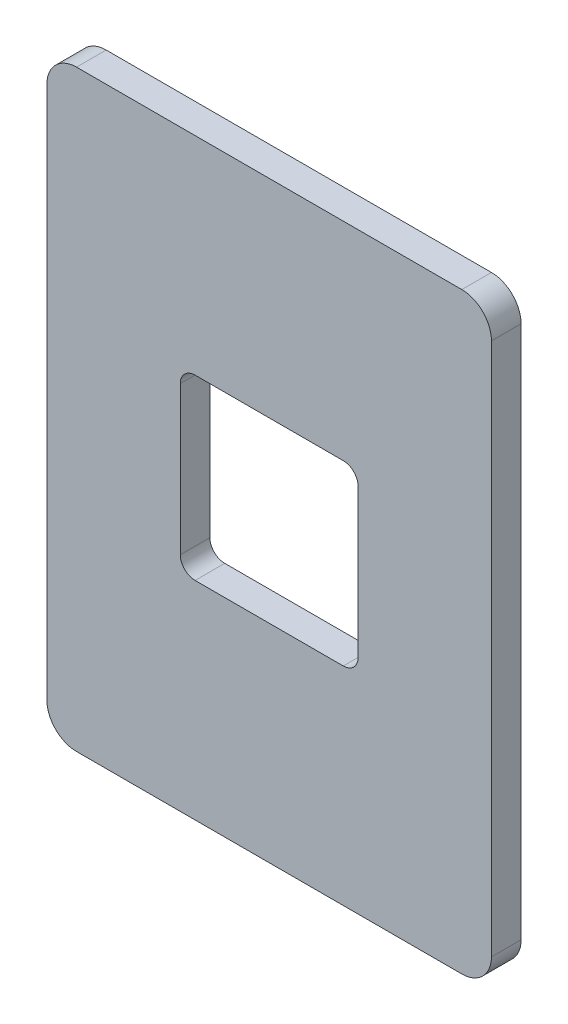
ISO-10303-21;
HEADER;
FILE_DESCRIPTION(('STEP AP214'),'2;1');
FILE_NAME('part.step','',(''),(''),'','','');
FILE_SCHEMA(('AUTOMOTIVE_DESIGN { 1 0 10303 214 1 1 1 1 }'));
ENDSEC;
DATA;
#1=APPLICATION_CONTEXT('core data for automotive mechanical design processes');
#2=APPLICATION_PROTOCOL_DEFINITION('international standard','automotive_design',2000,#1);
#3=PRODUCT_CONTEXT('',#1,'mechanical');
#4=PRODUCT('Part','Part','',(#3));
#5=PRODUCT_RELATED_PRODUCT_CATEGORY('part','',(#4));
#6=PRODUCT_DEFINITION_FORMATION('','',#4);
#7=PRODUCT_DEFINITION_CONTEXT('part definition',#1,'design');
#8=PRODUCT_DEFINITION('design','',#6,#7);
#9=PRODUCT_DEFINITION_SHAPE('','',#8);
#10=(LENGTH_UNIT() NAMED_UNIT(*) SI_UNIT(.MILLI.,.METRE.));
#11=(NAMED_UNIT(*) PLANE_ANGLE_UNIT() SI_UNIT($,.RADIAN.));
#12=(NAMED_UNIT(*) SI_UNIT($,.STERADIAN.) SOLID_ANGLE_UNIT());
#13=UNCERTAINTY_MEASURE_WITH_UNIT(LENGTH_MEASURE(1.E-05),#10,'distance_accuracy_value','');
#14=(GEOMETRIC_REPRESENTATION_CONTEXT(3) GLOBAL_UNCERTAINTY_ASSIGNED_CONTEXT((#13)) GLOBAL_UNIT_ASSIGNED_CONTEXT((#10,
#11,#12)) REPRESENTATION_CONTEXT('',''));
#15=CARTESIAN_POINT('',(0.,0.,0.));
#16=DIRECTION('',(0.,0.,1.));
#17=DIRECTION('',(1.,0.,0.));
#18=AXIS2_PLACEMENT_3D('',#15,#16,#17);
#19=CARTESIAN_POINT('',(15.,-20.,2.));
#20=DIRECTION('',(-1.,0.,0.));
#21=DIRECTION('',(0.,0.,1.));
#22=AXIS2_PLACEMENT_3D('',#19,#20,#21);
#23=PLANE('',#22);
#24=DIRECTION('',(0.,1.,0.));
#25=VECTOR('',#24,1.);
#26=CARTESIAN_POINT('',(15.,-20.,2.));
#27=LINE('',#26,#25);
#28=CARTESIAN_POINT('',(15.,-18.,2.));
#29=VERTEX_POINT('',#28);
#30=CARTESIAN_POINT('',(15.,18.,2.));
#31=VERTEX_POINT('',#30);
#32=EDGE_CURVE('E173',#29,#31,#27,.T.);
#33=ORIENTED_EDGE('',*,*,#32,.F.);
#34=DIRECTION('',(0.,0.,-1.));
#35=VECTOR('',#34,1.);
#36=CARTESIAN_POINT('',(15.,-18.,2.));
#37=LINE('',#36,#35);
#38=CARTESIAN_POINT('',(15.,-18.,0.));
#39=VERTEX_POINT('',#38);
#40=EDGE_CURVE('E157',#29,#39,#37,.T.);
#41=ORIENTED_EDGE('',*,*,#40,.T.);
#42=DIRECTION('',(0.,1.,0.));
#43=VECTOR('',#42,1.);
#44=CARTESIAN_POINT('',(15.,-20.,0.));
#45=LINE('',#44,#43);
#46=CARTESIAN_POINT('',(15.,18.,0.));
#47=VERTEX_POINT('',#46);
#48=EDGE_CURVE('E170',#39,#47,#45,.T.);
#49=ORIENTED_EDGE('',*,*,#48,.T.);
#50=DIRECTION('',(0.,0.,-1.));
#51=VECTOR('',#50,1.);
#52=CARTESIAN_POINT('',(15.,18.,2.));
#53=LINE('',#52,#51);
#54=EDGE_CURVE('E176',#47,#31,#53,.F.);
#55=ORIENTED_EDGE('',*,*,#54,.T.);
#56=EDGE_LOOP('',(#33,#41,#49,#55));
#57=FACE_BOUND('',#56,.T.);
#58=ADVANCED_FACE('F38',(#57),#23,.F.);
#59=CARTESIAN_POINT('',(-15.,20.,2.));
#60=DIRECTION('',(0.,-1.,0.));
#61=DIRECTION('',(0.,0.,-1.));
#62=AXIS2_PLACEMENT_3D('',#59,#60,#61);
#63=PLANE('',#62);
#64=DIRECTION('',(-1.,0.,0.));
#65=VECTOR('',#64,1.);
#66=CARTESIAN_POINT('',(-15.,20.,0.));
#67=LINE('',#66,#65);
#68=CARTESIAN_POINT('',(13.,20.,0.));
#69=VERTEX_POINT('',#68);
#70=CARTESIAN_POINT('',(-13.,20.,0.));
#71=VERTEX_POINT('',#70);
#72=EDGE_CURVE('E181',#69,#71,#67,.T.);
#73=ORIENTED_EDGE('',*,*,#72,.T.);
#74=DIRECTION('',(0.,0.,-1.));
#75=VECTOR('',#74,1.);
#76=CARTESIAN_POINT('',(-13.,20.,2.));
#77=LINE('',#76,#75);
#78=CARTESIAN_POINT('',(-13.,20.,2.));
#79=VERTEX_POINT('',#78);
#80=EDGE_CURVE('E238',#71,#79,#77,.F.);
#81=ORIENTED_EDGE('',*,*,#80,.T.);
#82=DIRECTION('',(-1.,0.,0.));
#83=VECTOR('',#82,1.);
#84=CARTESIAN_POINT('',(-15.,20.,2.));
#85=LINE('',#84,#83);
#86=CARTESIAN_POINT('',(13.,20.,2.));
#87=VERTEX_POINT('',#86);
#88=EDGE_CURVE('E324',#87,#79,#85,.T.);
#89=ORIENTED_EDGE('',*,*,#88,.F.);
#90=DIRECTION('',(0.,0.,-1.));
#91=VECTOR('',#90,1.);
#92=CARTESIAN_POINT('',(13.,20.,2.));
#93=LINE('',#92,#91);
#94=EDGE_CURVE('E234',#87,#69,#93,.T.);
#95=ORIENTED_EDGE('',*,*,#94,.T.);
#96=EDGE_LOOP('',(#73,#81,#89,#95));
#97=FACE_BOUND('',#96,.T.);
#98=ADVANCED_FACE('F350',(#97),#63,.F.);
#99=CARTESIAN_POINT('',(-15.,-20.,2.));
#100=DIRECTION('',(1.,0.,0.));
#101=DIRECTION('',(0.,0.,-1.));
#102=AXIS2_PLACEMENT_3D('',#99,#100,#101);
#103=PLANE('',#102);
#104=DIRECTION('',(0.,-1.,0.));
#105=VECTOR('',#104,1.);
#106=CARTESIAN_POINT('',(-15.,-20.,0.));
#107=LINE('',#106,#105);
#108=CARTESIAN_POINT('',(-15.,18.,0.));
#109=VERTEX_POINT('',#108);
#110=CARTESIAN_POINT('',(-15.,-18.,0.));
#111=VERTEX_POINT('',#110);
#112=EDGE_CURVE('E187',#109,#111,#107,.T.);
#113=ORIENTED_EDGE('',*,*,#112,.T.);
#114=DIRECTION('',(0.,0.,-1.));
#115=VECTOR('',#114,1.);
#116=CARTESIAN_POINT('',(-15.,-18.,2.));
#117=LINE('',#116,#115);
#118=CARTESIAN_POINT('',(-15.,-18.,2.));
#119=VERTEX_POINT('',#118);
#120=EDGE_CURVE('E231',#111,#119,#117,.F.);
#121=ORIENTED_EDGE('',*,*,#120,.T.);
#122=DIRECTION('',(0.,-1.,0.));
#123=VECTOR('',#122,1.);
#124=CARTESIAN_POINT('',(-15.,-20.,2.));
#125=LINE('',#124,#123);
#126=CARTESIAN_POINT('',(-15.,18.,2.));
#127=VERTEX_POINT('',#126);
#128=EDGE_CURVE('E327',#127,#119,#125,.T.);
#129=ORIENTED_EDGE('',*,*,#128,.F.);
#130=DIRECTION('',(0.,0.,-1.));
#131=VECTOR('',#130,1.);
#132=CARTESIAN_POINT('',(-15.,18.,2.));
#133=LINE('',#132,#131);
#134=EDGE_CURVE('E227',#127,#109,#133,.T.);
#135=ORIENTED_EDGE('',*,*,#134,.T.);
#136=EDGE_LOOP('',(#113,#121,#129,#135));
#137=FACE_BOUND('',#136,.T.);
#138=ADVANCED_FACE('F343',(#137),#103,.F.);
#139=CARTESIAN_POINT('',(-15.,-20.,2.));
#140=DIRECTION('',(0.,1.,0.));
#141=DIRECTION('',(0.,0.,1.));
#142=AXIS2_PLACEMENT_3D('',#139,#140,#141);
#143=PLANE('',#142);
#144=DIRECTION('',(1.,0.,0.));
#145=VECTOR('',#144,1.);
#146=CARTESIAN_POINT('',(-15.,-20.,0.));
#147=LINE('',#146,#145);
#148=CARTESIAN_POINT('',(-13.,-20.,0.));
#149=VERTEX_POINT('',#148);
#150=CARTESIAN_POINT('',(13.,-20.,0.));
#151=VERTEX_POINT('',#150);
#152=EDGE_CURVE('E198',#149,#151,#147,.T.);
#153=ORIENTED_EDGE('',*,*,#152,.T.);
#154=DIRECTION('',(0.,0.,-1.));
#155=VECTOR('',#154,1.);
#156=CARTESIAN_POINT('',(13.,-20.,2.));
#157=LINE('',#156,#155);
#158=CARTESIAN_POINT('',(13.,-20.,2.));
#159=VERTEX_POINT('',#158);
#160=EDGE_CURVE('E158',#151,#159,#157,.F.);
#161=ORIENTED_EDGE('',*,*,#160,.T.);
#162=DIRECTION('',(1.,0.,0.));
#163=VECTOR('',#162,1.);
#164=CARTESIAN_POINT('',(-15.,-20.,2.));
#165=LINE('',#164,#163);
#166=CARTESIAN_POINT('',(-13.,-20.,2.));
#167=VERTEX_POINT('',#166);
#168=EDGE_CURVE('E192',#167,#159,#165,.T.);
#169=ORIENTED_EDGE('',*,*,#168,.F.);
#170=DIRECTION('',(0.,0.,-1.));
#171=VECTOR('',#170,1.);
#172=CARTESIAN_POINT('',(-13.,-20.,2.));
#173=LINE('',#172,#171);
#174=EDGE_CURVE('E164',#167,#149,#173,.T.);
#175=ORIENTED_EDGE('',*,*,#174,.T.);
#176=EDGE_LOOP('',(#153,#161,#169,#175));
#177=FACE_BOUND('',#176,.T.);
#178=ADVANCED_FACE('F337',(#177),#143,.F.);
#179=CARTESIAN_POINT('',(0.,0.,2.));
#180=DIRECTION('',(0.,0.,-1.));
#181=DIRECTION('',(-1.,0.,0.));
#182=AXIS2_PLACEMENT_3D('',#179,#180,#181);
#183=PLANE('',#182);
#184=DIRECTION('',(0.,-1.,0.));
#185=VECTOR('',#184,1.);
#186=CARTESIAN_POINT('',(6.,0.,2.));
#187=LINE('',#186,#185);
#188=CARTESIAN_POINT('',(6.,5.,2.));
#189=VERTEX_POINT('',#188);
#190=CARTESIAN_POINT('',(6.,-5.,2.));
#191=VERTEX_POINT('',#190);
#192=EDGE_CURVE('E309',#189,#191,#187,.T.);
#193=ORIENTED_EDGE('',*,*,#192,.T.);
#194=CARTESIAN_POINT('',(5.,-5.,2.));
#195=DIRECTION('',(0.,0.,-1.));
#196=DIRECTION('',(-1.,0.,0.));
#197=AXIS2_PLACEMENT_3D('',#194,#195,#196);
#198=CIRCLE('',#197,1.);
#199=CARTESIAN_POINT('',(5.,-6.,2.));
#200=VERTEX_POINT('',#199);
#201=EDGE_CURVE('E277',#191,#200,#198,.T.);
#202=ORIENTED_EDGE('',*,*,#201,.T.);
#203=DIRECTION('',(-1.,0.,0.));
#204=VECTOR('',#203,1.);
#205=CARTESIAN_POINT('',(0.,-6.,2.));
#206=LINE('',#205,#204);
#207=CARTESIAN_POINT('',(-5.,-6.,2.));
#208=VERTEX_POINT('',#207);
#209=EDGE_CURVE('E189',#200,#208,#206,.T.);
#210=ORIENTED_EDGE('',*,*,#209,.T.);
#211=CARTESIAN_POINT('',(-5.,-5.,2.));
#212=DIRECTION('',(0.,0.,-1.));
#213=DIRECTION('',(-1.,0.,0.));
#214=AXIS2_PLACEMENT_3D('',#211,#212,#213);
#215=CIRCLE('',#214,1.);
#216=CARTESIAN_POINT('',(-6.,-5.,2.));
#217=VERTEX_POINT('',#216);
#218=EDGE_CURVE('E61',#208,#217,#215,.T.);
#219=ORIENTED_EDGE('',*,*,#218,.T.);
#220=DIRECTION('',(0.,1.,0.));
#221=VECTOR('',#220,1.);
#222=CARTESIAN_POINT('',(-6.,0.,2.));
#223=LINE('',#222,#221);
#224=CARTESIAN_POINT('',(-6.,5.,2.));
#225=VERTEX_POINT('',#224);
#226=EDGE_CURVE('E182',#217,#225,#223,.T.);
#227=ORIENTED_EDGE('',*,*,#226,.T.);
#228=CARTESIAN_POINT('',(-5.,5.,2.));
#229=DIRECTION('',(0.,0.,-1.));
#230=DIRECTION('',(-1.,0.,0.));
#231=AXIS2_PLACEMENT_3D('',#228,#229,#230);
#232=CIRCLE('',#231,1.);
#233=CARTESIAN_POINT('',(-5.,6.,2.));
#234=VERTEX_POINT('',#233);
#235=EDGE_CURVE('E11',#225,#234,#232,.T.);
#236=ORIENTED_EDGE('',*,*,#235,.T.);
#237=DIRECTION('',(1.,0.,0.));
#238=VECTOR('',#237,1.);
#239=CARTESIAN_POINT('',(0.,6.,2.));
#240=LINE('',#239,#238);
#241=CARTESIAN_POINT('',(5.,6.,2.));
#242=VERTEX_POINT('',#241);
#243=EDGE_CURVE('E303',#234,#242,#240,.T.);
#244=ORIENTED_EDGE('',*,*,#243,.T.);
#245=CARTESIAN_POINT('',(5.,5.,2.));
#246=DIRECTION('',(0.,0.,-1.));
#247=DIRECTION('',(-1.,0.,0.));
#248=AXIS2_PLACEMENT_3D('',#245,#246,#247);
#249=CIRCLE('',#248,1.);
#250=EDGE_CURVE('E271',#242,#189,#249,.T.);
#251=ORIENTED_EDGE('',*,*,#250,.T.);
#252=EDGE_LOOP('',(#193,#202,#210,#219,#227,#236,#244,#251));
#253=FACE_BOUND('',#252,.T.);
#254=ORIENTED_EDGE('',*,*,#168,.T.);
#255=CARTESIAN_POINT('',(13.,-18.,2.));
#256=DIRECTION('',(0.,0.,-1.));
#257=DIRECTION('',(-1.,0.,0.));
#258=AXIS2_PLACEMENT_3D('',#255,#256,#257);
#259=CIRCLE('',#258,2.);
#260=EDGE_CURVE('E224',#159,#29,#259,.F.);
#261=ORIENTED_EDGE('',*,*,#260,.T.);
#262=ORIENTED_EDGE('',*,*,#32,.T.);
#263=CARTESIAN_POINT('',(13.,18.,2.));
#264=DIRECTION('',(0.,0.,-1.));
#265=DIRECTION('',(-1.,0.,0.));
#266=AXIS2_PLACEMENT_3D('',#263,#264,#265);
#267=CIRCLE('',#266,2.);
#268=EDGE_CURVE('E215',#31,#87,#267,.F.);
#269=ORIENTED_EDGE('',*,*,#268,.T.);
#270=ORIENTED_EDGE('',*,*,#88,.T.);
#271=CARTESIAN_POINT('',(-13.,18.,2.));
#272=DIRECTION('',(0.,0.,-1.));
#273=DIRECTION('',(-1.,0.,0.));
#274=AXIS2_PLACEMENT_3D('',#271,#272,#273);
#275=CIRCLE('',#274,2.);
#276=EDGE_CURVE('E218',#79,#127,#275,.F.);
#277=ORIENTED_EDGE('',*,*,#276,.T.);
#278=ORIENTED_EDGE('',*,*,#128,.T.);
#279=CARTESIAN_POINT('',(-13.,-18.,2.));
#280=DIRECTION('',(0.,0.,-1.));
#281=DIRECTION('',(-1.,0.,0.));
#282=AXIS2_PLACEMENT_3D('',#279,#280,#281);
#283=CIRCLE('',#282,2.);
#284=EDGE_CURVE('E221',#119,#167,#283,.F.);
#285=ORIENTED_EDGE('',*,*,#284,.T.);
#286=EDGE_LOOP('',(#254,#261,#262,#269,#270,#277,#278,#285));
#287=FACE_BOUND('',#286,.T.);
#288=ADVANCED_FACE('F301',(#253,#287),#183,.F.);
#289=CARTESIAN_POINT('',(0.,0.,0.));
#290=DIRECTION('',(0.,0.,-1.));
#291=DIRECTION('',(-1.,0.,0.));
#292=AXIS2_PLACEMENT_3D('',#289,#290,#291);
#293=PLANE('',#292);
#294=DIRECTION('',(0.,1.,0.));
#295=VECTOR('',#294,1.);
#296=CARTESIAN_POINT('',(-6.,-6.,0.));
#297=LINE('',#296,#295);
#298=CARTESIAN_POINT('',(-6.,-5.,0.));
#299=VERTEX_POINT('',#298);
#300=CARTESIAN_POINT('',(-6.,5.,0.));
#301=VERTEX_POINT('',#300);
#302=EDGE_CURVE('E288',#299,#301,#297,.T.);
#303=ORIENTED_EDGE('',*,*,#302,.F.);
#304=CARTESIAN_POINT('',(-5.,-5.,0.));
#305=DIRECTION('',(0.,0.,-1.));
#306=DIRECTION('',(-1.,0.,0.));
#307=AXIS2_PLACEMENT_3D('',#304,#305,#306);
#308=CIRCLE('',#307,1.);
#309=CARTESIAN_POINT('',(-5.,-6.,0.));
#310=VERTEX_POINT('',#309);
#311=EDGE_CURVE('E280',#299,#310,#308,.F.);
#312=ORIENTED_EDGE('',*,*,#311,.T.);
#313=DIRECTION('',(-1.,0.,0.));
#314=VECTOR('',#313,1.);
#315=CARTESIAN_POINT('',(6.,-6.,0.));
#316=LINE('',#315,#314);
#317=CARTESIAN_POINT('',(5.,-6.,0.));
#318=VERTEX_POINT('',#317);
#319=EDGE_CURVE('E310',#318,#310,#316,.T.);
#320=ORIENTED_EDGE('',*,*,#319,.F.);
#321=CARTESIAN_POINT('',(5.,-5.,0.));
#322=DIRECTION('',(0.,0.,-1.));
#323=DIRECTION('',(-1.,0.,0.));
#324=AXIS2_PLACEMENT_3D('',#321,#322,#323);
#325=CIRCLE('',#324,1.);
#326=CARTESIAN_POINT('',(6.,-5.,0.));
#327=VERTEX_POINT('',#326);
#328=EDGE_CURVE('E274',#318,#327,#325,.F.);
#329=ORIENTED_EDGE('',*,*,#328,.T.);
#330=DIRECTION('',(0.,-1.,0.));
#331=VECTOR('',#330,1.);
#332=CARTESIAN_POINT('',(6.,-6.,0.));
#333=LINE('',#332,#331);
#334=CARTESIAN_POINT('',(6.,5.,0.));
#335=VERTEX_POINT('',#334);
#336=EDGE_CURVE('E316',#335,#327,#333,.T.);
#337=ORIENTED_EDGE('',*,*,#336,.F.);
#338=CARTESIAN_POINT('',(5.,5.,0.));
#339=DIRECTION('',(0.,0.,-1.));
#340=DIRECTION('',(-1.,0.,0.));
#341=AXIS2_PLACEMENT_3D('',#338,#339,#340);
#342=CIRCLE('',#341,1.);
#343=CARTESIAN_POINT('',(5.,6.,0.));
#344=VERTEX_POINT('',#343);
#345=EDGE_CURVE('E268',#335,#344,#342,.F.);
#346=ORIENTED_EDGE('',*,*,#345,.T.);
#347=DIRECTION('',(1.,0.,0.));
#348=VECTOR('',#347,1.);
#349=CARTESIAN_POINT('',(6.,6.,0.));
#350=LINE('',#349,#348);
#351=CARTESIAN_POINT('',(-5.,6.,0.));
#352=VERTEX_POINT('',#351);
#353=EDGE_CURVE('E290',#352,#344,#350,.T.);
#354=ORIENTED_EDGE('',*,*,#353,.F.);
#355=CARTESIAN_POINT('',(-5.,5.,0.));
#356=DIRECTION('',(0.,0.,-1.));
#357=DIRECTION('',(-1.,0.,0.));
#358=AXIS2_PLACEMENT_3D('',#355,#356,#357);
#359=CIRCLE('',#358,1.);
#360=EDGE_CURVE('E47',#352,#301,#359,.F.);
#361=ORIENTED_EDGE('',*,*,#360,.T.);
#362=EDGE_LOOP('',(#303,#312,#320,#329,#337,#346,#354,#361));
#363=FACE_BOUND('',#362,.T.);
#364=ORIENTED_EDGE('',*,*,#48,.F.);
#365=CARTESIAN_POINT('',(13.,-18.,0.));
#366=DIRECTION('',(0.,0.,-1.));
#367=DIRECTION('',(-1.,0.,0.));
#368=AXIS2_PLACEMENT_3D('',#365,#366,#367);
#369=CIRCLE('',#368,2.);
#370=EDGE_CURVE('E153',#39,#151,#369,.T.);
#371=ORIENTED_EDGE('',*,*,#370,.T.);
#372=ORIENTED_EDGE('',*,*,#152,.F.);
#373=CARTESIAN_POINT('',(-13.,-18.,0.));
#374=DIRECTION('',(0.,0.,-1.));
#375=DIRECTION('',(-1.,0.,0.));
#376=AXIS2_PLACEMENT_3D('',#373,#374,#375);
#377=CIRCLE('',#376,2.);
#378=EDGE_CURVE('E165',#149,#111,#377,.T.);
#379=ORIENTED_EDGE('',*,*,#378,.T.);
#380=ORIENTED_EDGE('',*,*,#112,.F.);
#381=CARTESIAN_POINT('',(-13.,18.,0.));
#382=DIRECTION('',(0.,0.,-1.));
#383=DIRECTION('',(-1.,0.,0.));
#384=AXIS2_PLACEMENT_3D('',#381,#382,#383);
#385=CIRCLE('',#384,2.);
#386=EDGE_CURVE('E205',#109,#71,#385,.T.);
#387=ORIENTED_EDGE('',*,*,#386,.T.);
#388=ORIENTED_EDGE('',*,*,#72,.F.);
#389=CARTESIAN_POINT('',(13.,18.,0.));
#390=DIRECTION('',(0.,0.,-1.));
#391=DIRECTION('',(-1.,0.,0.));
#392=AXIS2_PLACEMENT_3D('',#389,#390,#391);
#393=CIRCLE('',#392,2.);
#394=EDGE_CURVE('E175',#69,#47,#393,.T.);
#395=ORIENTED_EDGE('',*,*,#394,.T.);
#396=EDGE_LOOP('',(#364,#371,#372,#379,#380,#387,#388,#395));
#397=FACE_BOUND('',#396,.T.);
#398=ADVANCED_FACE('F178',(#363,#397),#293,.T.);
#399=CARTESIAN_POINT('',(13.,-18.,2.));
#400=DIRECTION('',(0.,0.,-1.));
#401=DIRECTION('',(-1.,0.,0.));
#402=AXIS2_PLACEMENT_3D('',#399,#400,#401);
#403=CYLINDRICAL_SURFACE('',#402,2.);
#404=ORIENTED_EDGE('',*,*,#260,.F.);
#405=ORIENTED_EDGE('',*,*,#160,.F.);
#406=ORIENTED_EDGE('',*,*,#370,.F.);
#407=ORIENTED_EDGE('',*,*,#40,.F.);
#408=EDGE_LOOP('',(#404,#405,#406,#407));
#409=FACE_BOUND('',#408,.T.);
#410=ADVANCED_FACE('F156',(#409),#403,.T.);
#411=CARTESIAN_POINT('',(-13.,-18.,2.));
#412=DIRECTION('',(0.,0.,-1.));
#413=DIRECTION('',(-1.,0.,0.));
#414=AXIS2_PLACEMENT_3D('',#411,#412,#413);
#415=CYLINDRICAL_SURFACE('',#414,2.);
#416=ORIENTED_EDGE('',*,*,#284,.F.);
#417=ORIENTED_EDGE('',*,*,#120,.F.);
#418=ORIENTED_EDGE('',*,*,#378,.F.);
#419=ORIENTED_EDGE('',*,*,#174,.F.);
#420=EDGE_LOOP('',(#416,#417,#418,#419));
#421=FACE_BOUND('',#420,.T.);
#422=ADVANCED_FACE('F339',(#421),#415,.T.);
#423=CARTESIAN_POINT('',(-13.,18.,2.));
#424=DIRECTION('',(0.,0.,-1.));
#425=DIRECTION('',(-1.,0.,0.));
#426=AXIS2_PLACEMENT_3D('',#423,#424,#425);
#427=CYLINDRICAL_SURFACE('',#426,2.);
#428=ORIENTED_EDGE('',*,*,#276,.F.);
#429=ORIENTED_EDGE('',*,*,#80,.F.);
#430=ORIENTED_EDGE('',*,*,#386,.F.);
#431=ORIENTED_EDGE('',*,*,#134,.F.);
#432=EDGE_LOOP('',(#428,#429,#430,#431));
#433=FACE_BOUND('',#432,.T.);
#434=ADVANCED_FACE('F347',(#433),#427,.T.);
#435=CARTESIAN_POINT('',(13.,18.,2.));
#436=DIRECTION('',(0.,0.,-1.));
#437=DIRECTION('',(-1.,0.,0.));
#438=AXIS2_PLACEMENT_3D('',#435,#436,#437);
#439=CYLINDRICAL_SURFACE('',#438,2.);
#440=ORIENTED_EDGE('',*,*,#268,.F.);
#441=ORIENTED_EDGE('',*,*,#54,.F.);
#442=ORIENTED_EDGE('',*,*,#394,.F.);
#443=ORIENTED_EDGE('',*,*,#94,.F.);
#444=EDGE_LOOP('',(#440,#441,#442,#443));
#445=FACE_BOUND('',#444,.T.);
#446=ADVANCED_FACE('F355',(#445),#439,.T.);
#447=CARTESIAN_POINT('',(-6.,-6.,10.));
#448=DIRECTION('',(-1.,0.,0.));
#449=DIRECTION('',(0.,0.,1.));
#450=AXIS2_PLACEMENT_3D('',#447,#448,#449);
#451=PLANE('',#450);
#452=ORIENTED_EDGE('',*,*,#226,.F.);
#453=DIRECTION('',(0.,0.,-1.));
#454=VECTOR('',#453,1.);
#455=CARTESIAN_POINT('',(-6.,-5.,0.));
#456=LINE('',#455,#454);
#457=EDGE_CURVE('E264',#217,#299,#456,.T.);
#458=ORIENTED_EDGE('',*,*,#457,.T.);
#459=ORIENTED_EDGE('',*,*,#302,.T.);
#460=DIRECTION('',(0.,0.,-1.));
#461=VECTOR('',#460,1.);
#462=CARTESIAN_POINT('',(-6.,5.,2.));
#463=LINE('',#462,#461);
#464=EDGE_CURVE('E54',#301,#225,#463,.F.);
#465=ORIENTED_EDGE('',*,*,#464,.T.);
#466=EDGE_LOOP('',(#452,#458,#459,#465));
#467=FACE_BOUND('',#466,.T.);
#468=ADVANCED_FACE('F293',(#467),#451,.F.);
#469=CARTESIAN_POINT('',(6.,-6.,10.));
#470=DIRECTION('',(0.,-1.,0.));
#471=DIRECTION('',(0.,0.,-1.));
#472=AXIS2_PLACEMENT_3D('',#469,#470,#471);
#473=PLANE('',#472);
#474=ORIENTED_EDGE('',*,*,#209,.F.);
#475=DIRECTION('',(0.,0.,-1.));
#476=VECTOR('',#475,1.);
#477=CARTESIAN_POINT('',(5.,-6.,0.));
#478=LINE('',#477,#476);
#479=EDGE_CURVE('E258',#200,#318,#478,.T.);
#480=ORIENTED_EDGE('',*,*,#479,.T.);
#481=ORIENTED_EDGE('',*,*,#319,.T.);
#482=DIRECTION('',(0.,0.,-1.));
#483=VECTOR('',#482,1.);
#484=CARTESIAN_POINT('',(-5.,-6.,2.));
#485=LINE('',#484,#483);
#486=EDGE_CURVE('E255',#310,#208,#485,.F.);
#487=ORIENTED_EDGE('',*,*,#486,.T.);
#488=EDGE_LOOP('',(#474,#480,#481,#487));
#489=FACE_BOUND('',#488,.T.);
#490=ADVANCED_FACE('F362',(#489),#473,.F.);
#491=CARTESIAN_POINT('',(6.,-6.,10.));
#492=DIRECTION('',(1.,0.,0.));
#493=DIRECTION('',(0.,0.,-1.));
#494=AXIS2_PLACEMENT_3D('',#491,#492,#493);
#495=PLANE('',#494);
#496=ORIENTED_EDGE('',*,*,#192,.F.);
#497=DIRECTION('',(0.,0.,-1.));
#498=VECTOR('',#497,1.);
#499=CARTESIAN_POINT('',(6.,5.,0.));
#500=LINE('',#499,#498);
#501=EDGE_CURVE('E244',#189,#335,#500,.T.);
#502=ORIENTED_EDGE('',*,*,#501,.T.);
#503=ORIENTED_EDGE('',*,*,#336,.T.);
#504=DIRECTION('',(0.,0.,-1.));
#505=VECTOR('',#504,1.);
#506=CARTESIAN_POINT('',(6.,-5.,2.));
#507=LINE('',#506,#505);
#508=EDGE_CURVE('E241',#327,#191,#507,.F.);
#509=ORIENTED_EDGE('',*,*,#508,.T.);
#510=EDGE_LOOP('',(#496,#502,#503,#509));
#511=FACE_BOUND('',#510,.T.);
#512=ADVANCED_FACE('F417',(#511),#495,.F.);
#513=CARTESIAN_POINT('',(6.,6.,10.));
#514=DIRECTION('',(0.,1.,0.));
#515=DIRECTION('',(0.,0.,1.));
#516=AXIS2_PLACEMENT_3D('',#513,#514,#515);
#517=PLANE('',#516);
#518=ORIENTED_EDGE('',*,*,#353,.T.);
#519=DIRECTION('',(0.,0.,-1.));
#520=VECTOR('',#519,1.);
#521=CARTESIAN_POINT('',(5.,6.,2.));
#522=LINE('',#521,#520);
#523=EDGE_CURVE('E252',#344,#242,#522,.F.);
#524=ORIENTED_EDGE('',*,*,#523,.T.);
#525=ORIENTED_EDGE('',*,*,#243,.F.);
#526=DIRECTION('',(0.,0.,-1.));
#527=VECTOR('',#526,1.);
#528=CARTESIAN_POINT('',(-5.,6.,0.));
#529=LINE('',#528,#527);
#530=EDGE_CURVE('E248',#234,#352,#529,.T.);
#531=ORIENTED_EDGE('',*,*,#530,.T.);
#532=EDGE_LOOP('',(#518,#524,#525,#531));
#533=FACE_BOUND('',#532,.T.);
#534=ADVANCED_FACE('F306',(#533),#517,.F.);
#535=CARTESIAN_POINT('',(5.,5.,10.));
#536=DIRECTION('',(0.,0.,1.));
#537=DIRECTION('',(1.,0.,0.));
#538=AXIS2_PLACEMENT_3D('',#535,#536,#537);
#539=CYLINDRICAL_SURFACE('',#538,1.);
#540=ORIENTED_EDGE('',*,*,#250,.F.);
#541=ORIENTED_EDGE('',*,*,#523,.F.);
#542=ORIENTED_EDGE('',*,*,#345,.F.);
#543=ORIENTED_EDGE('',*,*,#501,.F.);
#544=EDGE_LOOP('',(#540,#541,#542,#543));
#545=FACE_BOUND('',#544,.T.);
#546=ADVANCED_FACE('F436',(#545),#539,.F.);
#547=CARTESIAN_POINT('',(5.,-5.,10.));
#548=DIRECTION('',(0.,0.,1.));
#549=DIRECTION('',(1.,0.,0.));
#550=AXIS2_PLACEMENT_3D('',#547,#548,#549);
#551=CYLINDRICAL_SURFACE('',#550,1.);
#552=ORIENTED_EDGE('',*,*,#201,.F.);
#553=ORIENTED_EDGE('',*,*,#508,.F.);
#554=ORIENTED_EDGE('',*,*,#328,.F.);
#555=ORIENTED_EDGE('',*,*,#479,.F.);
#556=EDGE_LOOP('',(#552,#553,#554,#555));
#557=FACE_BOUND('',#556,.T.);
#558=ADVANCED_FACE('F445',(#557),#551,.F.);
#559=CARTESIAN_POINT('',(-5.,-5.,10.));
#560=DIRECTION('',(0.,0.,1.));
#561=DIRECTION('',(1.,0.,0.));
#562=AXIS2_PLACEMENT_3D('',#559,#560,#561);
#563=CYLINDRICAL_SURFACE('',#562,1.);
#564=ORIENTED_EDGE('',*,*,#218,.F.);
#565=ORIENTED_EDGE('',*,*,#486,.F.);
#566=ORIENTED_EDGE('',*,*,#311,.F.);
#567=ORIENTED_EDGE('',*,*,#457,.F.);
#568=EDGE_LOOP('',(#564,#565,#566,#567));
#569=FACE_BOUND('',#568,.T.);
#570=ADVANCED_FACE('F454',(#569),#563,.F.);
#571=CARTESIAN_POINT('',(-5.,5.,10.));
#572=DIRECTION('',(0.,0.,1.));
#573=DIRECTION('',(1.,0.,0.));
#574=AXIS2_PLACEMENT_3D('',#571,#572,#573);
#575=CYLINDRICAL_SURFACE('',#574,1.);
#576=ORIENTED_EDGE('',*,*,#235,.F.);
#577=ORIENTED_EDGE('',*,*,#464,.F.);
#578=ORIENTED_EDGE('',*,*,#360,.F.);
#579=ORIENTED_EDGE('',*,*,#530,.F.);
#580=EDGE_LOOP('',(#576,#577,#578,#579));
#581=FACE_BOUND('',#580,.T.);
#582=ADVANCED_FACE('F40',(#581),#575,.F.);
#583=CLOSED_SHELL('',(#58,#98,#138,#178,#288,#398,#410,#422,#434,#446,#468,#490,#512,#534,#546,
#558,#570,#582));
#584=MANIFOLD_SOLID_BREP('B2',#583);
#585=ADVANCED_BREP_SHAPE_REPRESENTATION('',(#18,#584),#14);
#586=SHAPE_DEFINITION_REPRESENTATION(#9,#585);
ENDSEC;
END-ISO-10303-21;
